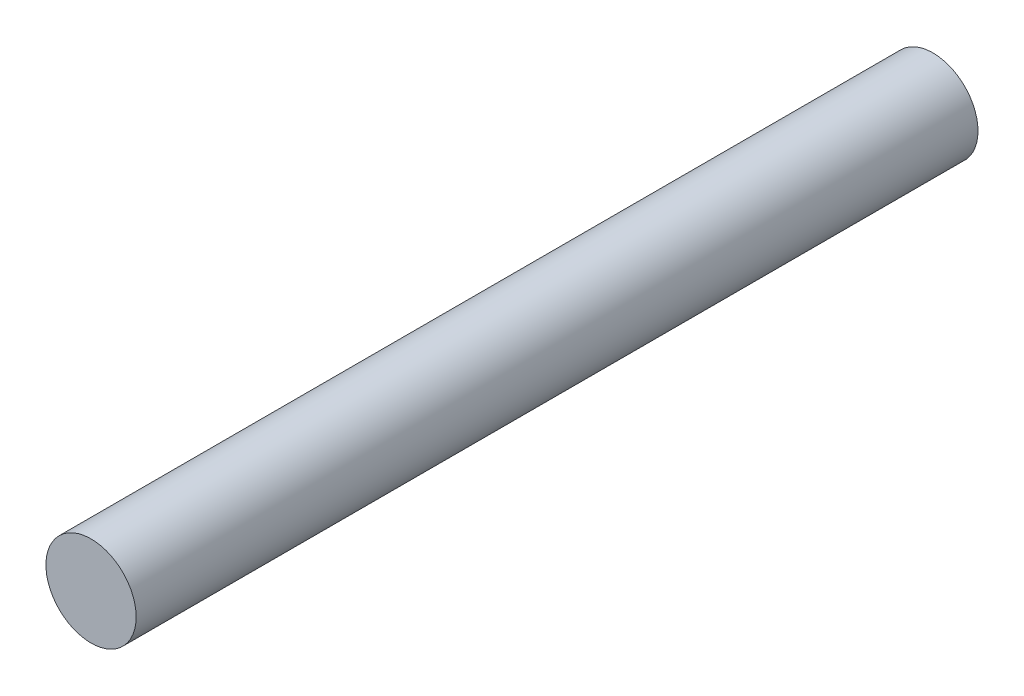
ISO-10303-21;
HEADER;
FILE_DESCRIPTION(('STEP AP214'),'2;1');
FILE_NAME('part.step','',(''),(''),'','','');
FILE_SCHEMA(('AUTOMOTIVE_DESIGN { 1 0 10303 214 1 1 1 1 }'));
ENDSEC;
DATA;
#1=APPLICATION_CONTEXT('core data for automotive mechanical design processes');
#2=APPLICATION_PROTOCOL_DEFINITION('international standard','automotive_design',2000,#1);
#3=PRODUCT_CONTEXT('',#1,'mechanical');
#4=PRODUCT('Part','Part','',(#3));
#5=PRODUCT_RELATED_PRODUCT_CATEGORY('part','',(#4));
#6=PRODUCT_DEFINITION_FORMATION('','',#4);
#7=PRODUCT_DEFINITION_CONTEXT('part definition',#1,'design');
#8=PRODUCT_DEFINITION('design','',#6,#7);
#9=PRODUCT_DEFINITION_SHAPE('','',#8);
#10=(LENGTH_UNIT() NAMED_UNIT(*) SI_UNIT(.MILLI.,.METRE.));
#11=(NAMED_UNIT(*) PLANE_ANGLE_UNIT() SI_UNIT($,.RADIAN.));
#12=(NAMED_UNIT(*) SI_UNIT($,.STERADIAN.) SOLID_ANGLE_UNIT());
#13=UNCERTAINTY_MEASURE_WITH_UNIT(LENGTH_MEASURE(1.E-05),#10,'distance_accuracy_value','');
#14=(GEOMETRIC_REPRESENTATION_CONTEXT(3) GLOBAL_UNCERTAINTY_ASSIGNED_CONTEXT((#13)) GLOBAL_UNIT_ASSIGNED_CONTEXT((#10,
#11,#12)) REPRESENTATION_CONTEXT('',''));
#15=CARTESIAN_POINT('',(0.,0.,0.));
#16=DIRECTION('',(0.,0.,1.));
#17=DIRECTION('',(1.,0.,0.));
#18=AXIS2_PLACEMENT_3D('',#15,#16,#17);
#19=CARTESIAN_POINT('',(0.,0.,200.));
#20=DIRECTION('',(0.,0.,-1.));
#21=DIRECTION('',(-1.,0.,0.));
#22=AXIS2_PLACEMENT_3D('',#19,#20,#21);
#23=CYLINDRICAL_SURFACE('',#22,10.7200241);
#24=CARTESIAN_POINT('',(0.,0.,200.));
#25=DIRECTION('',(0.,0.,1.));
#26=DIRECTION('',(1.,0.,0.));
#27=AXIS2_PLACEMENT_3D('',#24,#25,#26);
#28=CIRCLE('',#27,10.7200241);
#29=CARTESIAN_POINT('',(10.7200241,0.,200.));
#30=VERTEX_POINT('',#29);
#31=EDGE_CURVE('E10',#30,#30,#28,.T.);
#32=ORIENTED_EDGE('',*,*,#31,.F.);
#33=EDGE_LOOP('',(#32));
#34=FACE_BOUND('',#33,.T.);
#35=CARTESIAN_POINT('',(0.,0.,0.));
#36=DIRECTION('',(0.,0.,1.));
#37=DIRECTION('',(1.,0.,0.));
#38=AXIS2_PLACEMENT_3D('',#35,#36,#37);
#39=CIRCLE('',#38,10.7200241);
#40=CARTESIAN_POINT('',(10.7200241,0.,0.));
#41=VERTEX_POINT('',#40);
#42=EDGE_CURVE('E42',#41,#41,#39,.T.);
#43=ORIENTED_EDGE('',*,*,#42,.T.);
#44=EDGE_LOOP('',(#43));
#45=FACE_BOUND('',#44,.T.);
#46=ADVANCED_FACE('F39',(#34,#45),#23,.T.);
#47=CARTESIAN_POINT('',(0.,0.,200.));
#48=DIRECTION('',(0.,0.,1.));
#49=DIRECTION('',(1.,0.,0.));
#50=AXIS2_PLACEMENT_3D('',#47,#48,#49);
#51=PLANE('',#50);
#52=ORIENTED_EDGE('',*,*,#31,.T.);
#53=EDGE_LOOP('',(#52));
#54=FACE_BOUND('',#53,.T.);
#55=ADVANCED_FACE('F54',(#54),#51,.T.);
#56=CARTESIAN_POINT('',(0.,0.,0.));
#57=DIRECTION('',(0.,0.,1.));
#58=DIRECTION('',(1.,0.,0.));
#59=AXIS2_PLACEMENT_3D('',#56,#57,#58);
#60=PLANE('',#59);
#61=ORIENTED_EDGE('',*,*,#42,.F.);
#62=EDGE_LOOP('',(#61));
#63=FACE_BOUND('',#62,.T.);
#64=ADVANCED_FACE('F52',(#63),#60,.F.);
#65=CLOSED_SHELL('',(#46,#55,#64));
#66=MANIFOLD_SOLID_BREP('B2',#65);
#67=ADVANCED_BREP_SHAPE_REPRESENTATION('',(#18,#66),#14);
#68=SHAPE_DEFINITION_REPRESENTATION(#9,#67);
ENDSEC;
END-ISO-10303-21;
